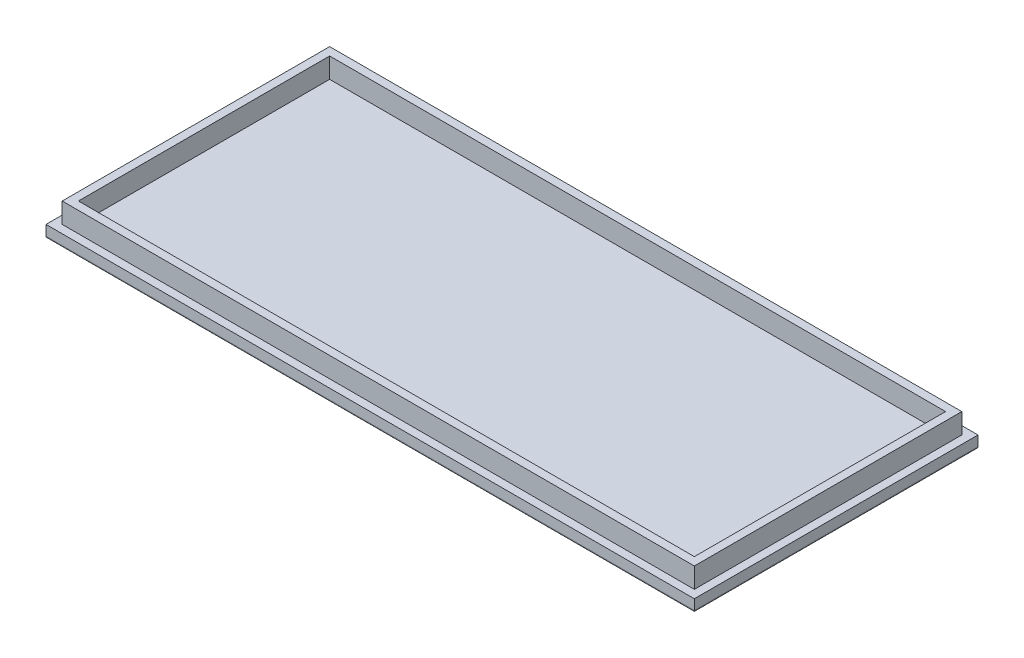
ISO-10303-21;
HEADER;
FILE_DESCRIPTION(('STEP AP214'),'2;1');
FILE_NAME('part.step','',(''),(''),'','','');
FILE_SCHEMA(('AUTOMOTIVE_DESIGN { 1 0 10303 214 1 1 1 1 }'));
ENDSEC;
DATA;
#1=APPLICATION_CONTEXT('core data for automotive mechanical design processes');
#2=APPLICATION_PROTOCOL_DEFINITION('international standard','automotive_design',2000,#1);
#3=PRODUCT_CONTEXT('',#1,'mechanical');
#4=PRODUCT('Part','Part','',(#3));
#5=PRODUCT_RELATED_PRODUCT_CATEGORY('part','',(#4));
#6=PRODUCT_DEFINITION_FORMATION('','',#4);
#7=PRODUCT_DEFINITION_CONTEXT('part definition',#1,'design');
#8=PRODUCT_DEFINITION('design','',#6,#7);
#9=PRODUCT_DEFINITION_SHAPE('','',#8);
#10=(LENGTH_UNIT() NAMED_UNIT(*) SI_UNIT(.MILLI.,.METRE.));
#11=(NAMED_UNIT(*) PLANE_ANGLE_UNIT() SI_UNIT($,.RADIAN.));
#12=(NAMED_UNIT(*) SI_UNIT($,.STERADIAN.) SOLID_ANGLE_UNIT());
#13=UNCERTAINTY_MEASURE_WITH_UNIT(LENGTH_MEASURE(1.E-05),#10,'distance_accuracy_value','');
#14=(GEOMETRIC_REPRESENTATION_CONTEXT(3) GLOBAL_UNCERTAINTY_ASSIGNED_CONTEXT((#13)) GLOBAL_UNIT_ASSIGNED_CONTEXT((#10,
#11,#12)) REPRESENTATION_CONTEXT('',''));
#15=CARTESIAN_POINT('',(0.,0.,0.));
#16=DIRECTION('',(0.,0.,1.));
#17=DIRECTION('',(1.,0.,0.));
#18=AXIS2_PLACEMENT_3D('',#15,#16,#17);
#19=CARTESIAN_POINT('',(0.,3.,0.));
#20=DIRECTION('',(0.,-1.,0.));
#21=DIRECTION('',(0.,0.,-1.));
#22=AXIS2_PLACEMENT_3D('',#19,#20,#21);
#23=PLANE('',#22);
#24=DIRECTION('',(0.,0.,1.));
#25=VECTOR('',#24,1.);
#26=CARTESIAN_POINT('',(-80.,3.,35.));
#27=LINE('',#26,#25);
#28=CARTESIAN_POINT('',(-80.,3.,-35.));
#29=VERTEX_POINT('',#28);
#30=CARTESIAN_POINT('',(-80.,3.,35.));
#31=VERTEX_POINT('',#30);
#32=EDGE_CURVE('E211',#29,#31,#27,.T.);
#33=ORIENTED_EDGE('',*,*,#32,.T.);
#34=DIRECTION('',(1.,0.,0.));
#35=VECTOR('',#34,1.);
#36=CARTESIAN_POINT('',(80.,3.,34.9999999999999));
#37=LINE('',#36,#35);
#38=CARTESIAN_POINT('',(80.,3.,34.9999999999999));
#39=VERTEX_POINT('',#38);
#40=EDGE_CURVE('E214',#31,#39,#37,.T.);
#41=ORIENTED_EDGE('',*,*,#40,.T.);
#42=DIRECTION('',(0.,0.,-1.));
#43=VECTOR('',#42,1.);
#44=CARTESIAN_POINT('',(80.,3.,34.9999999999999));
#45=LINE('',#44,#43);
#46=CARTESIAN_POINT('',(80.,3.,-35.));
#47=VERTEX_POINT('',#46);
#48=EDGE_CURVE('E216',#39,#47,#45,.T.);
#49=ORIENTED_EDGE('',*,*,#48,.T.);
#50=DIRECTION('',(-1.,0.,0.));
#51=VECTOR('',#50,1.);
#52=CARTESIAN_POINT('',(-80.,3.,-35.));
#53=LINE('',#52,#51);
#54=EDGE_CURVE('E218',#47,#29,#53,.T.);
#55=ORIENTED_EDGE('',*,*,#54,.T.);
#56=EDGE_LOOP('',(#33,#41,#49,#55));
#57=FACE_BOUND('',#56,.T.);
#58=DIRECTION('',(0.,0.,-1.));
#59=VECTOR('',#58,1.);
#60=CARTESIAN_POINT('',(78.,3.,33.));
#61=LINE('',#60,#59);
#62=CARTESIAN_POINT('',(78.,3.,33.));
#63=VERTEX_POINT('',#62);
#64=CARTESIAN_POINT('',(78.,3.,-33.));
#65=VERTEX_POINT('',#64);
#66=EDGE_CURVE('E194',#63,#65,#61,.T.);
#67=ORIENTED_EDGE('',*,*,#66,.F.);
#68=DIRECTION('',(1.,0.,0.));
#69=VECTOR('',#68,1.);
#70=CARTESIAN_POINT('',(78.,3.,33.));
#71=LINE('',#70,#69);
#72=CARTESIAN_POINT('',(-78.,3.,33.));
#73=VERTEX_POINT('',#72);
#74=EDGE_CURVE('E208',#73,#63,#71,.T.);
#75=ORIENTED_EDGE('',*,*,#74,.F.);
#76=DIRECTION('',(0.,0.,1.));
#77=VECTOR('',#76,1.);
#78=CARTESIAN_POINT('',(-78.,3.,33.));
#79=LINE('',#78,#77);
#80=CARTESIAN_POINT('',(-78.,3.,-33.));
#81=VERTEX_POINT('',#80);
#82=EDGE_CURVE('E205',#81,#73,#79,.T.);
#83=ORIENTED_EDGE('',*,*,#82,.F.);
#84=DIRECTION('',(-1.,0.,0.));
#85=VECTOR('',#84,1.);
#86=CARTESIAN_POINT('',(-78.,3.,-33.));
#87=LINE('',#86,#85);
#88=EDGE_CURVE('E202',#65,#81,#87,.T.);
#89=ORIENTED_EDGE('',*,*,#88,.F.);
#90=EDGE_LOOP('',(#67,#75,#83,#89));
#91=FACE_BOUND('',#90,.T.);
#92=ADVANCED_FACE('F33',(#57,#91),#23,.F.);
#93=CARTESIAN_POINT('',(0.,0.,0.));
#94=DIRECTION('',(0.,-1.,0.));
#95=DIRECTION('',(0.,0.,-1.));
#96=AXIS2_PLACEMENT_3D('',#93,#94,#95);
#97=PLANE('',#96);
#98=DIRECTION('',(0.,0.,-1.));
#99=VECTOR('',#98,1.);
#100=CARTESIAN_POINT('',(79.5,0.,34.9999999999999));
#101=LINE('',#100,#99);
#102=CARTESIAN_POINT('',(79.5,0.,-34.5));
#103=VERTEX_POINT('',#102);
#104=CARTESIAN_POINT('',(79.5,0.,34.4999999999999));
#105=VERTEX_POINT('',#104);
#106=EDGE_CURVE('E234',#103,#105,#101,.F.);
#107=ORIENTED_EDGE('',*,*,#106,.T.);
#108=DIRECTION('',(1.,0.,0.));
#109=VECTOR('',#108,1.);
#110=CARTESIAN_POINT('',(-80.,0.,34.5));
#111=LINE('',#110,#109);
#112=CARTESIAN_POINT('',(-79.5,0.,34.5));
#113=VERTEX_POINT('',#112);
#114=EDGE_CURVE('E239',#105,#113,#111,.F.);
#115=ORIENTED_EDGE('',*,*,#114,.T.);
#116=DIRECTION('',(0.,0.,1.));
#117=VECTOR('',#116,1.);
#118=CARTESIAN_POINT('',(-79.5,0.,-35.));
#119=LINE('',#118,#117);
#120=CARTESIAN_POINT('',(-79.5,0.,-34.5));
#121=VERTEX_POINT('',#120);
#122=EDGE_CURVE('E236',#113,#121,#119,.F.);
#123=ORIENTED_EDGE('',*,*,#122,.T.);
#124=DIRECTION('',(-1.,0.,0.));
#125=VECTOR('',#124,1.);
#126=CARTESIAN_POINT('',(80.,0.,-34.5));
#127=LINE('',#126,#125);
#128=EDGE_CURVE('E232',#121,#103,#127,.F.);
#129=ORIENTED_EDGE('',*,*,#128,.T.);
#130=EDGE_LOOP('',(#107,#115,#123,#129));
#131=FACE_BOUND('',#130,.T.);
#132=ADVANCED_FACE('F261',(#131),#97,.T.);
#133=CARTESIAN_POINT('',(-80.,3.,35.));
#134=DIRECTION('',(1.,0.,0.));
#135=DIRECTION('',(0.,0.,-1.));
#136=AXIS2_PLACEMENT_3D('',#133,#134,#135);
#137=PLANE('',#136);
#138=DIRECTION('',(0.,-1.,0.));
#139=VECTOR('',#138,1.);
#140=CARTESIAN_POINT('',(-80.,3.,-35.));
#141=LINE('',#140,#139);
#142=CARTESIAN_POINT('',(-80.,0.5,-35.));
#143=VERTEX_POINT('',#142);
#144=EDGE_CURVE('E220',#29,#143,#141,.T.);
#145=ORIENTED_EDGE('',*,*,#144,.T.);
#146=DIRECTION('',(0.,0.,1.));
#147=VECTOR('',#146,1.);
#148=CARTESIAN_POINT('',(-80.,0.5,35.));
#149=LINE('',#148,#147);
#150=CARTESIAN_POINT('',(-80.,0.5,35.));
#151=VERTEX_POINT('',#150);
#152=EDGE_CURVE('E229',#143,#151,#149,.T.);
#153=ORIENTED_EDGE('',*,*,#152,.T.);
#154=DIRECTION('',(0.,-1.,0.));
#155=VECTOR('',#154,1.);
#156=CARTESIAN_POINT('',(-80.,3.,35.));
#157=LINE('',#156,#155);
#158=EDGE_CURVE('E227',#31,#151,#157,.T.);
#159=ORIENTED_EDGE('',*,*,#158,.F.);
#160=ORIENTED_EDGE('',*,*,#32,.F.);
#161=EDGE_LOOP('',(#145,#153,#159,#160));
#162=FACE_BOUND('',#161,.T.);
#163=ADVANCED_FACE('F270',(#162),#137,.F.);
#164=CARTESIAN_POINT('',(80.,3.,34.9999999999999));
#165=DIRECTION('',(0.,0.,-1.));
#166=DIRECTION('',(-1.,0.,0.));
#167=AXIS2_PLACEMENT_3D('',#164,#165,#166);
#168=PLANE('',#167);
#169=ORIENTED_EDGE('',*,*,#158,.T.);
#170=DIRECTION('',(1.,0.,0.));
#171=VECTOR('',#170,1.);
#172=CARTESIAN_POINT('',(80.,0.5,34.9999999999999));
#173=LINE('',#172,#171);
#174=CARTESIAN_POINT('',(80.,0.5,34.9999999999999));
#175=VERTEX_POINT('',#174);
#176=EDGE_CURVE('E42',#151,#175,#173,.T.);
#177=ORIENTED_EDGE('',*,*,#176,.T.);
#178=DIRECTION('',(0.,-1.,0.));
#179=VECTOR('',#178,1.);
#180=CARTESIAN_POINT('',(80.,3.,34.9999999999999));
#181=LINE('',#180,#179);
#182=EDGE_CURVE('E225',#39,#175,#181,.T.);
#183=ORIENTED_EDGE('',*,*,#182,.F.);
#184=ORIENTED_EDGE('',*,*,#40,.F.);
#185=EDGE_LOOP('',(#169,#177,#183,#184));
#186=FACE_BOUND('',#185,.T.);
#187=ADVANCED_FACE('F273',(#186),#168,.F.);
#188=CARTESIAN_POINT('',(80.,3.,34.9999999999999));
#189=DIRECTION('',(-1.,0.,0.));
#190=DIRECTION('',(0.,0.,1.));
#191=AXIS2_PLACEMENT_3D('',#188,#189,#190);
#192=PLANE('',#191);
#193=ORIENTED_EDGE('',*,*,#182,.T.);
#194=DIRECTION('',(0.,0.,-1.));
#195=VECTOR('',#194,1.);
#196=CARTESIAN_POINT('',(80.,0.5,-35.));
#197=LINE('',#196,#195);
#198=CARTESIAN_POINT('',(80.,0.5,-35.));
#199=VERTEX_POINT('',#198);
#200=EDGE_CURVE('E56',#175,#199,#197,.T.);
#201=ORIENTED_EDGE('',*,*,#200,.T.);
#202=DIRECTION('',(0.,-1.,0.));
#203=VECTOR('',#202,1.);
#204=CARTESIAN_POINT('',(80.,3.,-35.));
#205=LINE('',#204,#203);
#206=EDGE_CURVE('E223',#47,#199,#205,.T.);
#207=ORIENTED_EDGE('',*,*,#206,.F.);
#208=ORIENTED_EDGE('',*,*,#48,.F.);
#209=EDGE_LOOP('',(#193,#201,#207,#208));
#210=FACE_BOUND('',#209,.T.);
#211=ADVANCED_FACE('F280',(#210),#192,.F.);
#212=CARTESIAN_POINT('',(-80.,3.,-35.));
#213=DIRECTION('',(0.,0.,1.));
#214=DIRECTION('',(1.,0.,0.));
#215=AXIS2_PLACEMENT_3D('',#212,#213,#214);
#216=PLANE('',#215);
#217=ORIENTED_EDGE('',*,*,#206,.T.);
#218=DIRECTION('',(-1.,0.,0.));
#219=VECTOR('',#218,1.);
#220=CARTESIAN_POINT('',(-80.,0.5,-35.));
#221=LINE('',#220,#219);
#222=EDGE_CURVE('E11',#199,#143,#221,.T.);
#223=ORIENTED_EDGE('',*,*,#222,.T.);
#224=ORIENTED_EDGE('',*,*,#144,.F.);
#225=ORIENTED_EDGE('',*,*,#54,.F.);
#226=EDGE_LOOP('',(#217,#223,#224,#225));
#227=FACE_BOUND('',#226,.T.);
#228=ADVANCED_FACE('F279',(#227),#216,.F.);
#229=CARTESIAN_POINT('',(-78.,0.,33.));
#230=DIRECTION('',(0.,0.,1.));
#231=DIRECTION('',(1.,0.,0.));
#232=AXIS2_PLACEMENT_3D('',#229,#230,#231);
#233=PLANE('',#232);
#234=ORIENTED_EDGE('',*,*,#74,.T.);
#235=DIRECTION('',(0.,1.,0.));
#236=VECTOR('',#235,1.);
#237=CARTESIAN_POINT('',(78.,0.,33.));
#238=LINE('',#237,#236);
#239=CARTESIAN_POINT('',(78.,8.,33.));
#240=VERTEX_POINT('',#239);
#241=EDGE_CURVE('E191',#63,#240,#238,.T.);
#242=ORIENTED_EDGE('',*,*,#241,.T.);
#243=DIRECTION('',(1.,0.,0.));
#244=VECTOR('',#243,1.);
#245=CARTESIAN_POINT('',(-78.,8.,33.));
#246=LINE('',#245,#244);
#247=CARTESIAN_POINT('',(-78.,8.,33.));
#248=VERTEX_POINT('',#247);
#249=EDGE_CURVE('E176',#248,#240,#246,.T.);
#250=ORIENTED_EDGE('',*,*,#249,.F.);
#251=DIRECTION('',(0.,1.,0.));
#252=VECTOR('',#251,1.);
#253=CARTESIAN_POINT('',(-78.,0.,33.));
#254=LINE('',#253,#252);
#255=EDGE_CURVE('E192',#73,#248,#254,.T.);
#256=ORIENTED_EDGE('',*,*,#255,.F.);
#257=EDGE_LOOP('',(#234,#242,#250,#256));
#258=FACE_BOUND('',#257,.T.);
#259=ADVANCED_FACE('F287',(#258),#233,.T.);
#260=CARTESIAN_POINT('',(78.,0.,-33.));
#261=DIRECTION('',(0.,0.,-1.));
#262=DIRECTION('',(-1.,0.,0.));
#263=AXIS2_PLACEMENT_3D('',#260,#261,#262);
#264=PLANE('',#263);
#265=ORIENTED_EDGE('',*,*,#88,.T.);
#266=DIRECTION('',(0.,1.,0.));
#267=VECTOR('',#266,1.);
#268=CARTESIAN_POINT('',(-78.,0.,-33.));
#269=LINE('',#268,#267);
#270=CARTESIAN_POINT('',(-78.,8.,-33.));
#271=VERTEX_POINT('',#270);
#272=EDGE_CURVE('E195',#81,#271,#269,.T.);
#273=ORIENTED_EDGE('',*,*,#272,.T.);
#274=DIRECTION('',(-1.,0.,0.));
#275=VECTOR('',#274,1.);
#276=CARTESIAN_POINT('',(78.,8.,-33.));
#277=LINE('',#276,#275);
#278=CARTESIAN_POINT('',(78.,8.,-33.));
#279=VERTEX_POINT('',#278);
#280=EDGE_CURVE('E185',#279,#271,#277,.T.);
#281=ORIENTED_EDGE('',*,*,#280,.F.);
#282=DIRECTION('',(0.,1.,0.));
#283=VECTOR('',#282,1.);
#284=CARTESIAN_POINT('',(78.,0.,-33.));
#285=LINE('',#284,#283);
#286=EDGE_CURVE('E197',#65,#279,#285,.T.);
#287=ORIENTED_EDGE('',*,*,#286,.F.);
#288=EDGE_LOOP('',(#265,#273,#281,#287));
#289=FACE_BOUND('',#288,.T.);
#290=ADVANCED_FACE('F299',(#289),#264,.T.);
#291=CARTESIAN_POINT('',(-78.,0.,-33.));
#292=DIRECTION('',(-1.,0.,0.));
#293=DIRECTION('',(0.,0.,1.));
#294=AXIS2_PLACEMENT_3D('',#291,#292,#293);
#295=PLANE('',#294);
#296=ORIENTED_EDGE('',*,*,#82,.T.);
#297=ORIENTED_EDGE('',*,*,#255,.T.);
#298=DIRECTION('',(0.,0.,1.));
#299=VECTOR('',#298,1.);
#300=CARTESIAN_POINT('',(-78.,8.,-33.));
#301=LINE('',#300,#299);
#302=EDGE_CURVE('E188',#271,#248,#301,.T.);
#303=ORIENTED_EDGE('',*,*,#302,.F.);
#304=ORIENTED_EDGE('',*,*,#272,.F.);
#305=EDGE_LOOP('',(#296,#297,#303,#304));
#306=FACE_BOUND('',#305,.T.);
#307=ADVANCED_FACE('F305',(#306),#295,.T.);
#308=CARTESIAN_POINT('',(78.,0.,33.));
#309=DIRECTION('',(1.,0.,0.));
#310=DIRECTION('',(0.,0.,-1.));
#311=AXIS2_PLACEMENT_3D('',#308,#309,#310);
#312=PLANE('',#311);
#313=ORIENTED_EDGE('',*,*,#66,.T.);
#314=ORIENTED_EDGE('',*,*,#286,.T.);
#315=DIRECTION('',(0.,0.,-1.));
#316=VECTOR('',#315,1.);
#317=CARTESIAN_POINT('',(78.,8.,33.));
#318=LINE('',#317,#316);
#319=EDGE_CURVE('E182',#240,#279,#318,.T.);
#320=ORIENTED_EDGE('',*,*,#319,.F.);
#321=ORIENTED_EDGE('',*,*,#241,.F.);
#322=EDGE_LOOP('',(#313,#314,#320,#321));
#323=FACE_BOUND('',#322,.T.);
#324=ADVANCED_FACE('F301',(#323),#312,.T.);
#325=CARTESIAN_POINT('',(0.,8.,0.));
#326=DIRECTION('',(0.,1.,0.));
#327=DIRECTION('',(0.,0.,1.));
#328=AXIS2_PLACEMENT_3D('',#325,#326,#327);
#329=PLANE('',#328);
#330=DIRECTION('',(0.,0.,1.));
#331=VECTOR('',#330,1.);
#332=CARTESIAN_POINT('',(-76.,8.,-31.));
#333=LINE('',#332,#331);
#334=CARTESIAN_POINT('',(-76.,8.,-31.));
#335=VERTEX_POINT('',#334);
#336=CARTESIAN_POINT('',(-76.,8.,31.));
#337=VERTEX_POINT('',#336);
#338=EDGE_CURVE('E144',#335,#337,#333,.T.);
#339=ORIENTED_EDGE('',*,*,#338,.F.);
#340=DIRECTION('',(-1.,0.,0.));
#341=VECTOR('',#340,1.);
#342=CARTESIAN_POINT('',(76.,8.,-31.));
#343=LINE('',#342,#341);
#344=CARTESIAN_POINT('',(76.,8.,-31.));
#345=VERTEX_POINT('',#344);
#346=EDGE_CURVE('E161',#345,#335,#343,.T.);
#347=ORIENTED_EDGE('',*,*,#346,.F.);
#348=DIRECTION('',(0.,0.,-1.));
#349=VECTOR('',#348,1.);
#350=CARTESIAN_POINT('',(76.,8.,31.));
#351=LINE('',#350,#349);
#352=CARTESIAN_POINT('',(76.,8.,31.));
#353=VERTEX_POINT('',#352);
#354=EDGE_CURVE('E164',#353,#345,#351,.T.);
#355=ORIENTED_EDGE('',*,*,#354,.F.);
#356=DIRECTION('',(1.,0.,0.));
#357=VECTOR('',#356,1.);
#358=CARTESIAN_POINT('',(-76.,8.,31.));
#359=LINE('',#358,#357);
#360=EDGE_CURVE('E170',#337,#353,#359,.T.);
#361=ORIENTED_EDGE('',*,*,#360,.F.);
#362=EDGE_LOOP('',(#339,#347,#355,#361));
#363=FACE_BOUND('',#362,.T.);
#364=ORIENTED_EDGE('',*,*,#249,.T.);
#365=ORIENTED_EDGE('',*,*,#319,.T.);
#366=ORIENTED_EDGE('',*,*,#280,.T.);
#367=ORIENTED_EDGE('',*,*,#302,.T.);
#368=EDGE_LOOP('',(#364,#365,#366,#367));
#369=FACE_BOUND('',#368,.T.);
#370=ADVANCED_FACE('F304',(#363,#369),#329,.T.);
#371=CARTESIAN_POINT('',(-76.,3.,-31.));
#372=DIRECTION('',(-1.,0.,0.));
#373=DIRECTION('',(0.,0.,1.));
#374=AXIS2_PLACEMENT_3D('',#371,#372,#373);
#375=PLANE('',#374);
#376=ORIENTED_EDGE('',*,*,#338,.T.);
#377=DIRECTION('',(0.,1.,0.));
#378=VECTOR('',#377,1.);
#379=CARTESIAN_POINT('',(-76.,3.,31.));
#380=LINE('',#379,#378);
#381=CARTESIAN_POINT('',(-76.,3.,31.));
#382=VERTEX_POINT('',#381);
#383=EDGE_CURVE('E137',#382,#337,#380,.T.);
#384=ORIENTED_EDGE('',*,*,#383,.F.);
#385=DIRECTION('',(0.,0.,1.));
#386=VECTOR('',#385,1.);
#387=CARTESIAN_POINT('',(-76.,3.,-31.));
#388=LINE('',#387,#386);
#389=CARTESIAN_POINT('',(-76.,3.,-31.));
#390=VERTEX_POINT('',#389);
#391=EDGE_CURVE('E141',#390,#382,#388,.T.);
#392=ORIENTED_EDGE('',*,*,#391,.F.);
#393=DIRECTION('',(0.,1.,0.));
#394=VECTOR('',#393,1.);
#395=CARTESIAN_POINT('',(-76.,3.,-31.));
#396=LINE('',#395,#394);
#397=EDGE_CURVE('E174',#390,#335,#396,.T.);
#398=ORIENTED_EDGE('',*,*,#397,.T.);
#399=EDGE_LOOP('',(#376,#384,#392,#398));
#400=FACE_BOUND('',#399,.T.);
#401=ADVANCED_FACE('F139',(#400),#375,.F.);
#402=CARTESIAN_POINT('',(76.,3.,-31.));
#403=DIRECTION('',(0.,0.,-1.));
#404=DIRECTION('',(-1.,0.,0.));
#405=AXIS2_PLACEMENT_3D('',#402,#403,#404);
#406=PLANE('',#405);
#407=ORIENTED_EDGE('',*,*,#346,.T.);
#408=ORIENTED_EDGE('',*,*,#397,.F.);
#409=DIRECTION('',(-1.,0.,0.));
#410=VECTOR('',#409,1.);
#411=CARTESIAN_POINT('',(76.,3.,-31.));
#412=LINE('',#411,#410);
#413=CARTESIAN_POINT('',(76.,3.,-31.));
#414=VERTEX_POINT('',#413);
#415=EDGE_CURVE('E149',#414,#390,#412,.T.);
#416=ORIENTED_EDGE('',*,*,#415,.F.);
#417=DIRECTION('',(0.,1.,0.));
#418=VECTOR('',#417,1.);
#419=CARTESIAN_POINT('',(76.,3.,-31.));
#420=LINE('',#419,#418);
#421=EDGE_CURVE('E177',#414,#345,#420,.T.);
#422=ORIENTED_EDGE('',*,*,#421,.T.);
#423=EDGE_LOOP('',(#407,#408,#416,#422));
#424=FACE_BOUND('',#423,.T.);
#425=ADVANCED_FACE('F318',(#424),#406,.F.);
#426=CARTESIAN_POINT('',(76.,3.,31.));
#427=DIRECTION('',(1.,0.,0.));
#428=DIRECTION('',(0.,0.,-1.));
#429=AXIS2_PLACEMENT_3D('',#426,#427,#428);
#430=PLANE('',#429);
#431=ORIENTED_EDGE('',*,*,#354,.T.);
#432=ORIENTED_EDGE('',*,*,#421,.F.);
#433=DIRECTION('',(0.,0.,-1.));
#434=VECTOR('',#433,1.);
#435=CARTESIAN_POINT('',(76.,3.,31.));
#436=LINE('',#435,#434);
#437=CARTESIAN_POINT('',(76.,3.,31.));
#438=VERTEX_POINT('',#437);
#439=EDGE_CURVE('E157',#438,#414,#436,.T.);
#440=ORIENTED_EDGE('',*,*,#439,.F.);
#441=DIRECTION('',(0.,1.,0.));
#442=VECTOR('',#441,1.);
#443=CARTESIAN_POINT('',(76.,3.,31.));
#444=LINE('',#443,#442);
#445=EDGE_CURVE('E148',#438,#353,#444,.T.);
#446=ORIENTED_EDGE('',*,*,#445,.T.);
#447=EDGE_LOOP('',(#431,#432,#440,#446));
#448=FACE_BOUND('',#447,.T.);
#449=ADVANCED_FACE('F321',(#448),#430,.F.);
#450=CARTESIAN_POINT('',(-76.,3.,31.));
#451=DIRECTION('',(0.,0.,1.));
#452=DIRECTION('',(1.,0.,0.));
#453=AXIS2_PLACEMENT_3D('',#450,#451,#452);
#454=PLANE('',#453);
#455=ORIENTED_EDGE('',*,*,#360,.T.);
#456=ORIENTED_EDGE('',*,*,#445,.F.);
#457=DIRECTION('',(1.,0.,0.));
#458=VECTOR('',#457,1.);
#459=CARTESIAN_POINT('',(-76.,3.,31.));
#460=LINE('',#459,#458);
#461=EDGE_CURVE('E152',#382,#438,#460,.T.);
#462=ORIENTED_EDGE('',*,*,#461,.F.);
#463=ORIENTED_EDGE('',*,*,#383,.T.);
#464=EDGE_LOOP('',(#455,#456,#462,#463));
#465=FACE_BOUND('',#464,.T.);
#466=ADVANCED_FACE('F153',(#465),#454,.F.);
#467=CARTESIAN_POINT('',(0.,3.,0.));
#468=DIRECTION('',(0.,1.,0.));
#469=DIRECTION('',(0.,0.,1.));
#470=AXIS2_PLACEMENT_3D('',#467,#468,#469);
#471=PLANE('',#470);
#472=ORIENTED_EDGE('',*,*,#391,.T.);
#473=ORIENTED_EDGE('',*,*,#461,.T.);
#474=ORIENTED_EDGE('',*,*,#439,.T.);
#475=ORIENTED_EDGE('',*,*,#415,.T.);
#476=EDGE_LOOP('',(#472,#473,#474,#475));
#477=FACE_BOUND('',#476,.T.);
#478=ADVANCED_FACE('F159',(#477),#471,.T.);
#479=CARTESIAN_POINT('',(79.5,0.5,34.9999999999999));
#480=DIRECTION('',(0.,0.,1.));
#481=DIRECTION('',(1.,0.,0.));
#482=AXIS2_PLACEMENT_3D('',#479,#480,#481);
#483=CYLINDRICAL_SURFACE('',#482,0.5);
#484=CARTESIAN_POINT('',(79.5,0.5,34.4999999999999));
#485=DIRECTION('',(-0.707106781186547,0.,0.707106781186548));
#486=DIRECTION('',(-0.707106781186548,0.,-0.707106781186547));
#487=AXIS2_PLACEMENT_3D('',#484,#485,#486);
#488=ELLIPSE('',#487,0.707106781186547,0.5);
#489=EDGE_CURVE('E246',#105,#175,#488,.T.);
#490=ORIENTED_EDGE('',*,*,#489,.F.);
#491=ORIENTED_EDGE('',*,*,#106,.F.);
#492=CARTESIAN_POINT('',(79.5,0.5,-34.5));
#493=DIRECTION('',(0.707106781186548,0.,0.707106781186547));
#494=DIRECTION('',(0.707106781186547,0.,-0.707106781186548));
#495=AXIS2_PLACEMENT_3D('',#492,#493,#494);
#496=ELLIPSE('',#495,0.707106781186547,0.5);
#497=EDGE_CURVE('E37',#199,#103,#496,.F.);
#498=ORIENTED_EDGE('',*,*,#497,.F.);
#499=ORIENTED_EDGE('',*,*,#200,.F.);
#500=EDGE_LOOP('',(#490,#491,#498,#499));
#501=FACE_BOUND('',#500,.T.);
#502=ADVANCED_FACE('F35',(#501),#483,.T.);
#503=CARTESIAN_POINT('',(-80.,0.5,-34.5));
#504=DIRECTION('',(1.,0.,0.));
#505=DIRECTION('',(0.,0.,-1.));
#506=AXIS2_PLACEMENT_3D('',#503,#504,#505);
#507=CYLINDRICAL_SURFACE('',#506,0.5);
#508=ORIENTED_EDGE('',*,*,#497,.T.);
#509=ORIENTED_EDGE('',*,*,#128,.F.);
#510=CARTESIAN_POINT('',(-79.5,0.5,-34.5));
#511=DIRECTION('',(0.707106781186547,0.,-0.707106781186548));
#512=DIRECTION('',(0.707106781186548,0.,0.707106781186547));
#513=AXIS2_PLACEMENT_3D('',#510,#511,#512);
#514=ELLIPSE('',#513,0.707106781186548,0.5);
#515=EDGE_CURVE('E245',#143,#121,#514,.F.);
#516=ORIENTED_EDGE('',*,*,#515,.F.);
#517=ORIENTED_EDGE('',*,*,#222,.F.);
#518=EDGE_LOOP('',(#508,#509,#516,#517));
#519=FACE_BOUND('',#518,.T.);
#520=ADVANCED_FACE('F256',(#519),#507,.T.);
#521=CARTESIAN_POINT('',(80.,0.5,34.4999999999999));
#522=DIRECTION('',(-1.,0.,0.));
#523=DIRECTION('',(0.,0.,1.));
#524=AXIS2_PLACEMENT_3D('',#521,#522,#523);
#525=CYLINDRICAL_SURFACE('',#524,0.5);
#526=ORIENTED_EDGE('',*,*,#489,.T.);
#527=ORIENTED_EDGE('',*,*,#176,.F.);
#528=CARTESIAN_POINT('',(-79.5,0.5,34.5));
#529=DIRECTION('',(-0.707106781186548,0.,-0.707106781186547));
#530=DIRECTION('',(-0.707106781186547,0.,0.707106781186548));
#531=AXIS2_PLACEMENT_3D('',#528,#529,#530);
#532=ELLIPSE('',#531,0.707106781186548,0.5);
#533=EDGE_CURVE('E243',#113,#151,#532,.T.);
#534=ORIENTED_EDGE('',*,*,#533,.F.);
#535=ORIENTED_EDGE('',*,*,#114,.F.);
#536=EDGE_LOOP('',(#526,#527,#534,#535));
#537=FACE_BOUND('',#536,.T.);
#538=ADVANCED_FACE('F267',(#537),#525,.T.);
#539=CARTESIAN_POINT('',(-79.5,0.5,35.));
#540=DIRECTION('',(0.,0.,-1.));
#541=DIRECTION('',(-1.,0.,0.));
#542=AXIS2_PLACEMENT_3D('',#539,#540,#541);
#543=CYLINDRICAL_SURFACE('',#542,0.5);
#544=ORIENTED_EDGE('',*,*,#515,.T.);
#545=ORIENTED_EDGE('',*,*,#122,.F.);
#546=ORIENTED_EDGE('',*,*,#533,.T.);
#547=ORIENTED_EDGE('',*,*,#152,.F.);
#548=EDGE_LOOP('',(#544,#545,#546,#547));
#549=FACE_BOUND('',#548,.T.);
#550=ADVANCED_FACE('F265',(#549),#543,.T.);
#551=CLOSED_SHELL('',(#92,#132,#163,#187,#211,#228,#259,#290,#307,#324,#370,#401,#425,#449,#466,
#478,#502,#520,#538,#550));
#552=MANIFOLD_SOLID_BREP('B2',#551);
#553=ADVANCED_BREP_SHAPE_REPRESENTATION('',(#18,#552),#14);
#554=SHAPE_DEFINITION_REPRESENTATION(#9,#553);
ENDSEC;
END-ISO-10303-21;
